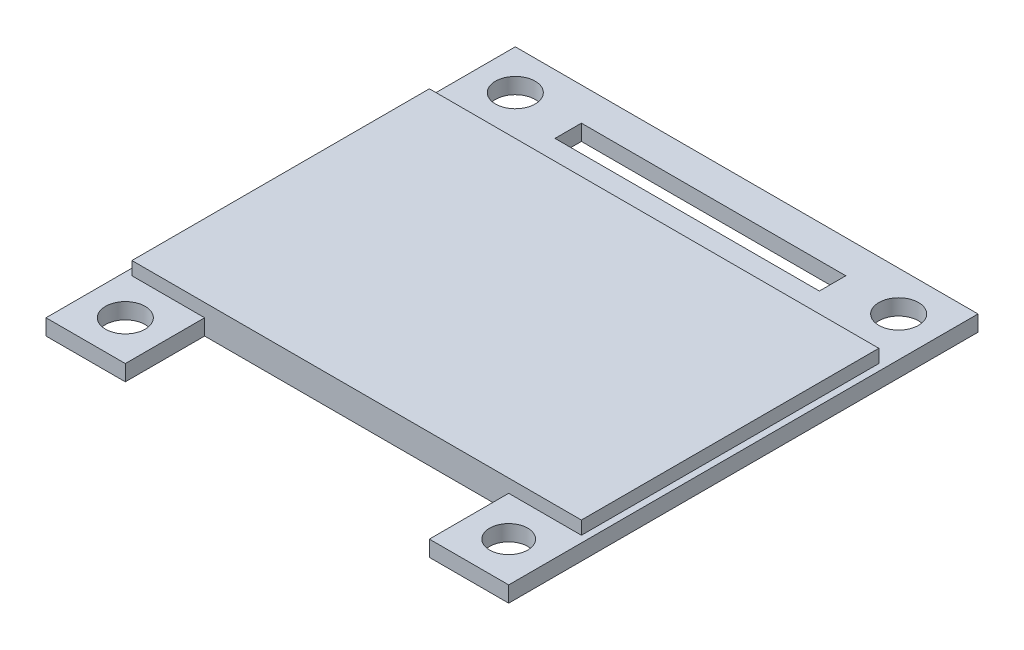
ISO-10303-21;
HEADER;
FILE_DESCRIPTION(('STEP AP214'),'2;1');
FILE_NAME('part.step','',(''),(''),'','','');
FILE_SCHEMA(('AUTOMOTIVE_DESIGN { 1 0 10303 214 1 1 1 1 }'));
ENDSEC;
DATA;
#1=APPLICATION_CONTEXT('core data for automotive mechanical design processes');
#2=APPLICATION_PROTOCOL_DEFINITION('international standard','automotive_design',2000,#1);
#3=PRODUCT_CONTEXT('',#1,'mechanical');
#4=PRODUCT('Part','Part','',(#3));
#5=PRODUCT_RELATED_PRODUCT_CATEGORY('part','',(#4));
#6=PRODUCT_DEFINITION_FORMATION('','',#4);
#7=PRODUCT_DEFINITION_CONTEXT('part definition',#1,'design');
#8=PRODUCT_DEFINITION('design','',#6,#7);
#9=PRODUCT_DEFINITION_SHAPE('','',#8);
#10=(LENGTH_UNIT() NAMED_UNIT(*) SI_UNIT(.MILLI.,.METRE.));
#11=(NAMED_UNIT(*) PLANE_ANGLE_UNIT() SI_UNIT($,.RADIAN.));
#12=(NAMED_UNIT(*) SI_UNIT($,.STERADIAN.) SOLID_ANGLE_UNIT());
#13=UNCERTAINTY_MEASURE_WITH_UNIT(LENGTH_MEASURE(1.E-05),#10,'distance_accuracy_value','');
#14=(GEOMETRIC_REPRESENTATION_CONTEXT(3) GLOBAL_UNCERTAINTY_ASSIGNED_CONTEXT((#13)) GLOBAL_UNIT_ASSIGNED_CONTEXT((#10,
#11,#12)) REPRESENTATION_CONTEXT('',''));
#15=CARTESIAN_POINT('',(0.,0.,0.));
#16=DIRECTION('',(0.,0.,1.));
#17=DIRECTION('',(1.,0.,0.));
#18=AXIS2_PLACEMENT_3D('',#15,#16,#17);
#19=CARTESIAN_POINT('',(0.,1.2,-27.));
#20=DIRECTION('',(0.,0.,-1.));
#21=DIRECTION('',(-1.,0.,0.));
#22=AXIS2_PLACEMENT_3D('',#19,#20,#21);
#23=PLANE('',#22);
#24=DIRECTION('',(1.,0.,0.));
#25=VECTOR('',#24,1.);
#26=CARTESIAN_POINT('',(0.,0.,-27.));
#27=LINE('',#26,#25);
#28=CARTESIAN_POINT('',(7.49999999999999,0.,-27.));
#29=VERTEX_POINT('',#28);
#30=CARTESIAN_POINT('',(27.5,0.,-27.));
#31=VERTEX_POINT('',#30);
#32=EDGE_CURVE('E206',#29,#31,#27,.T.);
#33=ORIENTED_EDGE('',*,*,#32,.T.);
#34=DIRECTION('',(0.,-1.,0.));
#35=VECTOR('',#34,1.);
#36=CARTESIAN_POINT('',(27.5,1.2,-27.));
#37=LINE('',#36,#35);
#38=CARTESIAN_POINT('',(27.5,1.2,-27.));
#39=VERTEX_POINT('',#38);
#40=EDGE_CURVE('E11',#39,#31,#37,.T.);
#41=ORIENTED_EDGE('',*,*,#40,.F.);
#42=DIRECTION('',(1.,0.,0.));
#43=VECTOR('',#42,1.);
#44=CARTESIAN_POINT('',(0.,1.2,-27.));
#45=LINE('',#44,#43);
#46=CARTESIAN_POINT('',(7.49999999999999,1.2,-27.));
#47=VERTEX_POINT('',#46);
#48=EDGE_CURVE('E140',#47,#39,#45,.T.);
#49=ORIENTED_EDGE('',*,*,#48,.F.);
#50=DIRECTION('',(0.,-1.,0.));
#51=VECTOR('',#50,1.);
#52=CARTESIAN_POINT('',(7.49999999999999,1.2,-27.));
#53=LINE('',#52,#51);
#54=EDGE_CURVE('E59',#47,#29,#53,.T.);
#55=ORIENTED_EDGE('',*,*,#54,.T.);
#56=EDGE_LOOP('',(#33,#41,#49,#55));
#57=FACE_BOUND('',#56,.T.);
#58=ADVANCED_FACE('F39',(#57),#23,.F.);
#59=CARTESIAN_POINT('',(27.5,1.2,0.));
#60=DIRECTION('',(1.,0.,0.));
#61=DIRECTION('',(0.,0.,-1.));
#62=AXIS2_PLACEMENT_3D('',#59,#60,#61);
#63=PLANE('',#62);
#64=DIRECTION('',(0.,0.,1.));
#65=VECTOR('',#64,1.);
#66=CARTESIAN_POINT('',(27.5,0.,0.));
#67=LINE('',#66,#65);
#68=CARTESIAN_POINT('',(27.5,0.,-25.));
#69=VERTEX_POINT('',#68);
#70=EDGE_CURVE('E147',#31,#69,#67,.T.);
#71=ORIENTED_EDGE('',*,*,#70,.T.);
#72=DIRECTION('',(0.,-1.,0.));
#73=VECTOR('',#72,1.);
#74=CARTESIAN_POINT('',(27.5,1.2,-25.));
#75=LINE('',#74,#73);
#76=CARTESIAN_POINT('',(27.5,1.2,-25.));
#77=VERTEX_POINT('',#76);
#78=EDGE_CURVE('E50',#77,#69,#75,.T.);
#79=ORIENTED_EDGE('',*,*,#78,.F.);
#80=DIRECTION('',(0.,0.,1.));
#81=VECTOR('',#80,1.);
#82=CARTESIAN_POINT('',(27.5,1.2,0.));
#83=LINE('',#82,#81);
#84=EDGE_CURVE('E133',#39,#77,#83,.T.);
#85=ORIENTED_EDGE('',*,*,#84,.F.);
#86=ORIENTED_EDGE('',*,*,#40,.T.);
#87=EDGE_LOOP('',(#71,#79,#85,#86));
#88=FACE_BOUND('',#87,.T.);
#89=ADVANCED_FACE('F146',(#88),#63,.F.);
#90=CARTESIAN_POINT('',(0.,1.2,-25.));
#91=DIRECTION('',(0.,0.,-1.));
#92=DIRECTION('',(-1.,0.,0.));
#93=AXIS2_PLACEMENT_3D('',#90,#91,#92);
#94=PLANE('',#93);
#95=DIRECTION('',(1.,0.,0.));
#96=VECTOR('',#95,1.);
#97=CARTESIAN_POINT('',(0.,0.,-25.));
#98=LINE('',#97,#96);
#99=CARTESIAN_POINT('',(7.49999999999999,0.,-25.));
#100=VERTEX_POINT('',#99);
#101=EDGE_CURVE('E211',#100,#69,#98,.T.);
#102=ORIENTED_EDGE('',*,*,#101,.F.);
#103=DIRECTION('',(0.,-1.,0.));
#104=VECTOR('',#103,1.);
#105=CARTESIAN_POINT('',(7.49999999999999,1.2,-25.));
#106=LINE('',#105,#104);
#107=CARTESIAN_POINT('',(7.49999999999999,1.2,-25.));
#108=VERTEX_POINT('',#107);
#109=EDGE_CURVE('E95',#108,#100,#106,.T.);
#110=ORIENTED_EDGE('',*,*,#109,.F.);
#111=DIRECTION('',(1.,0.,0.));
#112=VECTOR('',#111,1.);
#113=CARTESIAN_POINT('',(0.,1.2,-25.));
#114=LINE('',#113,#112);
#115=EDGE_CURVE('E139',#108,#77,#114,.T.);
#116=ORIENTED_EDGE('',*,*,#115,.T.);
#117=ORIENTED_EDGE('',*,*,#78,.T.);
#118=EDGE_LOOP('',(#102,#110,#116,#117));
#119=FACE_BOUND('',#118,.T.);
#120=ADVANCED_FACE('F152',(#119),#94,.T.);
#121=CARTESIAN_POINT('',(29.,1.2,0.));
#122=DIRECTION('',(1.,0.,0.));
#123=DIRECTION('',(0.,0.,-1.));
#124=AXIS2_PLACEMENT_3D('',#121,#122,#123);
#125=PLANE('',#124);
#126=DIRECTION('',(0.,0.,1.));
#127=VECTOR('',#126,1.);
#128=CARTESIAN_POINT('',(29.,0.,0.));
#129=LINE('',#128,#127);
#130=CARTESIAN_POINT('',(29.,0.,0.));
#131=VERTEX_POINT('',#130);
#132=CARTESIAN_POINT('',(29.,0.,6.));
#133=VERTEX_POINT('',#132);
#134=EDGE_CURVE('E169',#131,#133,#129,.T.);
#135=ORIENTED_EDGE('',*,*,#134,.T.);
#136=DIRECTION('',(0.,-1.,0.));
#137=VECTOR('',#136,1.);
#138=CARTESIAN_POINT('',(29.,1.2,6.));
#139=LINE('',#138,#137);
#140=CARTESIAN_POINT('',(29.,1.2,6.));
#141=VERTEX_POINT('',#140);
#142=EDGE_CURVE('E244',#141,#133,#139,.T.);
#143=ORIENTED_EDGE('',*,*,#142,.F.);
#144=DIRECTION('',(0.,0.,1.));
#145=VECTOR('',#144,1.);
#146=CARTESIAN_POINT('',(29.,1.2,0.));
#147=LINE('',#146,#145);
#148=CARTESIAN_POINT('',(29.,1.2,0.));
#149=VERTEX_POINT('',#148);
#150=EDGE_CURVE('E108',#149,#141,#147,.T.);
#151=ORIENTED_EDGE('',*,*,#150,.F.);
#152=DIRECTION('',(0.,-1.,0.));
#153=VECTOR('',#152,1.);
#154=CARTESIAN_POINT('',(29.,1.2,0.));
#155=LINE('',#154,#153);
#156=EDGE_CURVE('E43',#149,#131,#155,.T.);
#157=ORIENTED_EDGE('',*,*,#156,.T.);
#158=EDGE_LOOP('',(#135,#143,#151,#157));
#159=FACE_BOUND('',#158,.T.);
#160=ADVANCED_FACE('F255',(#159),#125,.F.);
#161=CARTESIAN_POINT('',(0.,1.2,6.00000000000001));
#162=DIRECTION('',(0.,0.,1.));
#163=DIRECTION('',(1.,0.,0.));
#164=AXIS2_PLACEMENT_3D('',#161,#162,#163);
#165=PLANE('',#164);
#166=DIRECTION('',(-1.,0.,0.));
#167=VECTOR('',#166,1.);
#168=CARTESIAN_POINT('',(0.,0.,6.00000000000001));
#169=LINE('',#168,#167);
#170=CARTESIAN_POINT('',(35.,0.,6.));
#171=VERTEX_POINT('',#170);
#172=EDGE_CURVE('E174',#171,#133,#169,.T.);
#173=ORIENTED_EDGE('',*,*,#172,.F.);
#174=DIRECTION('',(0.,-1.,0.));
#175=VECTOR('',#174,1.);
#176=CARTESIAN_POINT('',(35.,1.2,6.));
#177=LINE('',#176,#175);
#178=CARTESIAN_POINT('',(35.,1.2,6.));
#179=VERTEX_POINT('',#178);
#180=EDGE_CURVE('E242',#179,#171,#177,.T.);
#181=ORIENTED_EDGE('',*,*,#180,.F.);
#182=DIRECTION('',(-1.,0.,0.));
#183=VECTOR('',#182,1.);
#184=CARTESIAN_POINT('',(0.,1.2,6.00000000000001));
#185=LINE('',#184,#183);
#186=EDGE_CURVE('E269',#179,#141,#185,.T.);
#187=ORIENTED_EDGE('',*,*,#186,.T.);
#188=ORIENTED_EDGE('',*,*,#142,.T.);
#189=EDGE_LOOP('',(#173,#181,#187,#188));
#190=FACE_BOUND('',#189,.T.);
#191=ADVANCED_FACE('F268',(#190),#165,.T.);
#192=CARTESIAN_POINT('',(35.,1.2,0.));
#193=DIRECTION('',(1.,0.,0.));
#194=DIRECTION('',(0.,0.,-1.));
#195=AXIS2_PLACEMENT_3D('',#192,#193,#194);
#196=PLANE('',#195);
#197=DIRECTION('',(0.,0.,1.));
#198=VECTOR('',#197,1.);
#199=CARTESIAN_POINT('',(35.,0.,0.));
#200=LINE('',#199,#198);
#201=CARTESIAN_POINT('',(35.,0.,-29.5));
#202=VERTEX_POINT('',#201);
#203=EDGE_CURVE('E178',#202,#171,#200,.T.);
#204=ORIENTED_EDGE('',*,*,#203,.F.);
#205=DIRECTION('',(0.,-1.,0.));
#206=VECTOR('',#205,1.);
#207=CARTESIAN_POINT('',(35.,1.2,-29.5));
#208=LINE('',#207,#206);
#209=CARTESIAN_POINT('',(35.,1.2,-29.5));
#210=VERTEX_POINT('',#209);
#211=EDGE_CURVE('E239',#210,#202,#208,.T.);
#212=ORIENTED_EDGE('',*,*,#211,.F.);
#213=DIRECTION('',(0.,0.,1.));
#214=VECTOR('',#213,1.);
#215=CARTESIAN_POINT('',(35.,1.2,0.));
#216=LINE('',#215,#214);
#217=EDGE_CURVE('E275',#210,#179,#216,.T.);
#218=ORIENTED_EDGE('',*,*,#217,.T.);
#219=ORIENTED_EDGE('',*,*,#180,.T.);
#220=EDGE_LOOP('',(#204,#212,#218,#219));
#221=FACE_BOUND('',#220,.T.);
#222=ADVANCED_FACE('F279',(#221),#196,.T.);
#223=CARTESIAN_POINT('',(0.,1.2,-29.5));
#224=DIRECTION('',(0.,0.,-1.));
#225=DIRECTION('',(-1.,0.,0.));
#226=AXIS2_PLACEMENT_3D('',#223,#224,#225);
#227=PLANE('',#226);
#228=DIRECTION('',(1.,0.,0.));
#229=VECTOR('',#228,1.);
#230=CARTESIAN_POINT('',(0.,0.,-29.5));
#231=LINE('',#230,#229);
#232=CARTESIAN_POINT('',(0.,0.,-29.5));
#233=VERTEX_POINT('',#232);
#234=EDGE_CURVE('E182',#233,#202,#231,.T.);
#235=ORIENTED_EDGE('',*,*,#234,.F.);
#236=DIRECTION('',(0.,-1.,0.));
#237=VECTOR('',#236,1.);
#238=CARTESIAN_POINT('',(0.,1.2,-29.5));
#239=LINE('',#238,#237);
#240=CARTESIAN_POINT('',(0.,1.2,-29.5));
#241=VERTEX_POINT('',#240);
#242=EDGE_CURVE('E236',#241,#233,#239,.T.);
#243=ORIENTED_EDGE('',*,*,#242,.F.);
#244=DIRECTION('',(1.,0.,0.));
#245=VECTOR('',#244,1.);
#246=CARTESIAN_POINT('',(0.,1.2,-29.5));
#247=LINE('',#246,#245);
#248=EDGE_CURVE('E281',#241,#210,#247,.T.);
#249=ORIENTED_EDGE('',*,*,#248,.T.);
#250=ORIENTED_EDGE('',*,*,#211,.T.);
#251=EDGE_LOOP('',(#235,#243,#249,#250));
#252=FACE_BOUND('',#251,.T.);
#253=ADVANCED_FACE('F368',(#252),#227,.T.);
#254=CARTESIAN_POINT('',(0.,1.2,0.));
#255=DIRECTION('',(-1.,0.,0.));
#256=DIRECTION('',(0.,0.,1.));
#257=AXIS2_PLACEMENT_3D('',#254,#255,#256);
#258=PLANE('',#257);
#259=DIRECTION('',(0.,0.,-1.));
#260=VECTOR('',#259,1.);
#261=CARTESIAN_POINT('',(0.,0.,0.));
#262=LINE('',#261,#260);
#263=CARTESIAN_POINT('',(0.,0.,6.));
#264=VERTEX_POINT('',#263);
#265=EDGE_CURVE('E186',#264,#233,#262,.T.);
#266=ORIENTED_EDGE('',*,*,#265,.F.);
#267=DIRECTION('',(0.,-1.,0.));
#268=VECTOR('',#267,1.);
#269=CARTESIAN_POINT('',(0.,1.2,6.));
#270=LINE('',#269,#268);
#271=CARTESIAN_POINT('',(0.,1.2,6.));
#272=VERTEX_POINT('',#271);
#273=EDGE_CURVE('E233',#272,#264,#270,.T.);
#274=ORIENTED_EDGE('',*,*,#273,.F.);
#275=DIRECTION('',(0.,0.,-1.));
#276=VECTOR('',#275,1.);
#277=CARTESIAN_POINT('',(0.,1.2,0.));
#278=LINE('',#277,#276);
#279=EDGE_CURVE('E284',#272,#241,#278,.T.);
#280=ORIENTED_EDGE('',*,*,#279,.T.);
#281=ORIENTED_EDGE('',*,*,#242,.T.);
#282=EDGE_LOOP('',(#266,#274,#280,#281));
#283=FACE_BOUND('',#282,.T.);
#284=ADVANCED_FACE('F364',(#283),#258,.T.);
#285=CARTESIAN_POINT('',(0.,1.2,6.));
#286=DIRECTION('',(0.,0.,-1.));
#287=DIRECTION('',(-1.,0.,0.));
#288=AXIS2_PLACEMENT_3D('',#285,#286,#287);
#289=PLANE('',#288);
#290=DIRECTION('',(1.,0.,0.));
#291=VECTOR('',#290,1.);
#292=CARTESIAN_POINT('',(0.,0.,6.));
#293=LINE('',#292,#291);
#294=CARTESIAN_POINT('',(6.,0.,6.));
#295=VERTEX_POINT('',#294);
#296=EDGE_CURVE('E190',#264,#295,#293,.T.);
#297=ORIENTED_EDGE('',*,*,#296,.T.);
#298=DIRECTION('',(0.,-1.,0.));
#299=VECTOR('',#298,1.);
#300=CARTESIAN_POINT('',(6.,1.2,6.));
#301=LINE('',#300,#299);
#302=CARTESIAN_POINT('',(6.,1.2,6.));
#303=VERTEX_POINT('',#302);
#304=EDGE_CURVE('E230',#303,#295,#301,.T.);
#305=ORIENTED_EDGE('',*,*,#304,.F.);
#306=DIRECTION('',(1.,0.,0.));
#307=VECTOR('',#306,1.);
#308=CARTESIAN_POINT('',(0.,1.2,6.));
#309=LINE('',#308,#307);
#310=EDGE_CURVE('E291',#272,#303,#309,.T.);
#311=ORIENTED_EDGE('',*,*,#310,.F.);
#312=ORIENTED_EDGE('',*,*,#273,.T.);
#313=EDGE_LOOP('',(#297,#305,#311,#312));
#314=FACE_BOUND('',#313,.T.);
#315=ADVANCED_FACE('F360',(#314),#289,.F.);
#316=CARTESIAN_POINT('',(6.,1.2,0.));
#317=DIRECTION('',(1.,0.,0.));
#318=DIRECTION('',(0.,0.,-1.));
#319=AXIS2_PLACEMENT_3D('',#316,#317,#318);
#320=PLANE('',#319);
#321=DIRECTION('',(0.,0.,1.));
#322=VECTOR('',#321,1.);
#323=CARTESIAN_POINT('',(6.,0.,0.));
#324=LINE('',#323,#322);
#325=CARTESIAN_POINT('',(6.,0.,0.));
#326=VERTEX_POINT('',#325);
#327=EDGE_CURVE('E194',#326,#295,#324,.T.);
#328=ORIENTED_EDGE('',*,*,#327,.F.);
#329=DIRECTION('',(0.,-1.,0.));
#330=VECTOR('',#329,1.);
#331=CARTESIAN_POINT('',(6.,1.2,0.));
#332=LINE('',#331,#330);
#333=CARTESIAN_POINT('',(6.,1.2,0.));
#334=VERTEX_POINT('',#333);
#335=EDGE_CURVE('E164',#334,#326,#332,.T.);
#336=ORIENTED_EDGE('',*,*,#335,.F.);
#337=DIRECTION('',(0.,0.,1.));
#338=VECTOR('',#337,1.);
#339=CARTESIAN_POINT('',(6.,1.2,0.));
#340=LINE('',#339,#338);
#341=EDGE_CURVE('E294',#334,#303,#340,.T.);
#342=ORIENTED_EDGE('',*,*,#341,.T.);
#343=ORIENTED_EDGE('',*,*,#304,.T.);
#344=EDGE_LOOP('',(#328,#336,#342,#343));
#345=FACE_BOUND('',#344,.T.);
#346=ADVANCED_FACE('F357',(#345),#320,.T.);
#347=CARTESIAN_POINT('',(7.50000000000001,1.2,0.));
#348=DIRECTION('',(1.,0.,0.));
#349=DIRECTION('',(0.,0.,-1.));
#350=AXIS2_PLACEMENT_3D('',#347,#348,#349);
#351=PLANE('',#350);
#352=DIRECTION('',(0.,0.,1.));
#353=VECTOR('',#352,1.);
#354=CARTESIAN_POINT('',(7.50000000000001,0.,0.));
#355=LINE('',#354,#353);
#356=EDGE_CURVE('E214',#29,#100,#355,.T.);
#357=ORIENTED_EDGE('',*,*,#356,.F.);
#358=ORIENTED_EDGE('',*,*,#54,.F.);
#359=DIRECTION('',(0.,0.,1.));
#360=VECTOR('',#359,1.);
#361=CARTESIAN_POINT('',(7.50000000000001,1.2,0.));
#362=LINE('',#361,#360);
#363=EDGE_CURVE('E154',#47,#108,#362,.T.);
#364=ORIENTED_EDGE('',*,*,#363,.T.);
#365=ORIENTED_EDGE('',*,*,#109,.T.);
#366=EDGE_LOOP('',(#357,#358,#364,#365));
#367=FACE_BOUND('',#366,.T.);
#368=ADVANCED_FACE('F353',(#367),#351,.T.);
#369=CARTESIAN_POINT('',(3.,1.2,-26.5));
#370=DIRECTION('',(0.,-1.,0.));
#371=DIRECTION('',(0.,0.,-1.));
#372=AXIS2_PLACEMENT_3D('',#369,#370,#371);
#373=CYLINDRICAL_SURFACE('',#372,1.5);
#374=CARTESIAN_POINT('',(3.,1.2,-26.5));
#375=DIRECTION('',(0.,1.,0.));
#376=DIRECTION('',(0.,0.,1.));
#377=AXIS2_PLACEMENT_3D('',#374,#375,#376);
#378=CIRCLE('',#377,1.5);
#379=CARTESIAN_POINT('',(3.,1.2,-25.));
#380=VERTEX_POINT('',#379);
#381=EDGE_CURVE('E318',#380,#380,#378,.T.);
#382=ORIENTED_EDGE('',*,*,#381,.T.);
#383=EDGE_LOOP('',(#382));
#384=FACE_BOUND('',#383,.T.);
#385=CARTESIAN_POINT('',(3.,0.,-26.5));
#386=DIRECTION('',(0.,1.,0.));
#387=DIRECTION('',(0.,0.,1.));
#388=AXIS2_PLACEMENT_3D('',#385,#386,#387);
#389=CIRCLE('',#388,1.5);
#390=CARTESIAN_POINT('',(3.,0.,-25.));
#391=VERTEX_POINT('',#390);
#392=EDGE_CURVE('E202',#391,#391,#389,.T.);
#393=ORIENTED_EDGE('',*,*,#392,.F.);
#394=EDGE_LOOP('',(#393));
#395=FACE_BOUND('',#394,.T.);
#396=ADVANCED_FACE('F324',(#384,#395),#373,.F.);
#397=CARTESIAN_POINT('',(32.,1.2,-26.5));
#398=DIRECTION('',(0.,-1.,0.));
#399=DIRECTION('',(0.,0.,-1.));
#400=AXIS2_PLACEMENT_3D('',#397,#398,#399);
#401=CYLINDRICAL_SURFACE('',#400,1.5);
#402=CARTESIAN_POINT('',(32.,1.2,-26.5));
#403=DIRECTION('',(0.,1.,0.));
#404=DIRECTION('',(0.,0.,1.));
#405=AXIS2_PLACEMENT_3D('',#402,#403,#404);
#406=CIRCLE('',#405,1.5);
#407=CARTESIAN_POINT('',(32.,1.2,-25.));
#408=VERTEX_POINT('',#407);
#409=EDGE_CURVE('E314',#408,#408,#406,.T.);
#410=ORIENTED_EDGE('',*,*,#409,.T.);
#411=EDGE_LOOP('',(#410));
#412=FACE_BOUND('',#411,.T.);
#413=CARTESIAN_POINT('',(32.,0.,-26.5));
#414=DIRECTION('',(0.,1.,0.));
#415=DIRECTION('',(0.,0.,1.));
#416=AXIS2_PLACEMENT_3D('',#413,#414,#415);
#417=CIRCLE('',#416,1.5);
#418=CARTESIAN_POINT('',(32.,0.,-25.));
#419=VERTEX_POINT('',#418);
#420=EDGE_CURVE('E198',#419,#419,#417,.T.);
#421=ORIENTED_EDGE('',*,*,#420,.F.);
#422=EDGE_LOOP('',(#421));
#423=FACE_BOUND('',#422,.T.);
#424=ADVANCED_FACE('F352',(#412,#423),#401,.F.);
#425=CARTESIAN_POINT('',(32.,1.2,3.));
#426=DIRECTION('',(0.,-1.,0.));
#427=DIRECTION('',(0.,0.,-1.));
#428=AXIS2_PLACEMENT_3D('',#425,#426,#427);
#429=CYLINDRICAL_SURFACE('',#428,1.43967062224583);
#430=CARTESIAN_POINT('',(32.,1.2,3.));
#431=DIRECTION('',(0.,1.,0.));
#432=DIRECTION('',(0.,0.,1.));
#433=AXIS2_PLACEMENT_3D('',#430,#431,#432);
#434=CIRCLE('',#433,1.43967062224583);
#435=CARTESIAN_POINT('',(32.,1.2,4.43967062224583));
#436=VERTEX_POINT('',#435);
#437=EDGE_CURVE('E222',#436,#436,#434,.T.);
#438=ORIENTED_EDGE('',*,*,#437,.T.);
#439=EDGE_LOOP('',(#438));
#440=FACE_BOUND('',#439,.T.);
#441=CARTESIAN_POINT('',(32.,0.,3.));
#442=DIRECTION('',(0.,1.,0.));
#443=DIRECTION('',(0.,0.,1.));
#444=AXIS2_PLACEMENT_3D('',#441,#442,#443);
#445=CIRCLE('',#444,1.43967062224583);
#446=CARTESIAN_POINT('',(32.,0.,4.43967062224583));
#447=VERTEX_POINT('',#446);
#448=EDGE_CURVE('E165',#447,#447,#445,.T.);
#449=ORIENTED_EDGE('',*,*,#448,.F.);
#450=EDGE_LOOP('',(#449));
#451=FACE_BOUND('',#450,.T.);
#452=ADVANCED_FACE('F41',(#440,#451),#429,.F.);
#453=CARTESIAN_POINT('',(3.,1.2,3.));
#454=DIRECTION('',(0.,-1.,0.));
#455=DIRECTION('',(0.,0.,-1.));
#456=AXIS2_PLACEMENT_3D('',#453,#454,#455);
#457=CYLINDRICAL_SURFACE('',#456,1.5);
#458=CARTESIAN_POINT('',(3.,1.2,3.));
#459=DIRECTION('',(0.,1.,0.));
#460=DIRECTION('',(0.,0.,1.));
#461=AXIS2_PLACEMENT_3D('',#458,#459,#460);
#462=CIRCLE('',#461,1.5);
#463=CARTESIAN_POINT('',(3.,1.2,4.5));
#464=VERTEX_POINT('',#463);
#465=EDGE_CURVE('E157',#464,#464,#462,.T.);
#466=ORIENTED_EDGE('',*,*,#465,.T.);
#467=EDGE_LOOP('',(#466));
#468=FACE_BOUND('',#467,.T.);
#469=CARTESIAN_POINT('',(3.,0.,3.));
#470=DIRECTION('',(0.,1.,0.));
#471=DIRECTION('',(0.,0.,1.));
#472=AXIS2_PLACEMENT_3D('',#469,#470,#471);
#473=CIRCLE('',#472,1.5);
#474=CARTESIAN_POINT('',(3.,0.,4.5));
#475=VERTEX_POINT('',#474);
#476=EDGE_CURVE('E218',#475,#475,#473,.T.);
#477=ORIENTED_EDGE('',*,*,#476,.F.);
#478=EDGE_LOOP('',(#477));
#479=FACE_BOUND('',#478,.T.);
#480=ADVANCED_FACE('F328',(#468,#479),#457,.F.);
#481=CARTESIAN_POINT('',(0.,1.2,0.));
#482=DIRECTION('',(0.,1.,0.));
#483=DIRECTION('',(0.,0.,1.));
#484=AXIS2_PLACEMENT_3D('',#481,#482,#483);
#485=PLANE('',#484);
#486=ORIENTED_EDGE('',*,*,#437,.F.);
#487=EDGE_LOOP('',(#486));
#488=FACE_BOUND('',#487,.T.);
#489=DIRECTION('',(1.,0.,0.));
#490=VECTOR('',#489,1.);
#491=CARTESIAN_POINT('',(0.,1.2,0.));
#492=LINE('',#491,#490);
#493=CARTESIAN_POINT('',(34.5,1.2,0.));
#494=VERTEX_POINT('',#493);
#495=EDGE_CURVE('E537',#149,#494,#492,.T.);
#496=ORIENTED_EDGE('',*,*,#495,.F.);
#497=ORIENTED_EDGE('',*,*,#150,.T.);
#498=ORIENTED_EDGE('',*,*,#186,.F.);
#499=ORIENTED_EDGE('',*,*,#217,.F.);
#500=ORIENTED_EDGE('',*,*,#248,.F.);
#501=ORIENTED_EDGE('',*,*,#279,.F.);
#502=ORIENTED_EDGE('',*,*,#310,.T.);
#503=ORIENTED_EDGE('',*,*,#341,.F.);
#504=DIRECTION('',(1.,0.,0.));
#505=VECTOR('',#504,1.);
#506=CARTESIAN_POINT('',(0.,1.2,0.));
#507=LINE('',#506,#505);
#508=CARTESIAN_POINT('',(0.500000000000002,1.2,0.));
#509=VERTEX_POINT('',#508);
#510=EDGE_CURVE('E298',#509,#334,#507,.T.);
#511=ORIENTED_EDGE('',*,*,#510,.F.);
#512=DIRECTION('',(0.,0.,1.));
#513=VECTOR('',#512,1.);
#514=CARTESIAN_POINT('',(0.500000000000003,1.2,0.));
#515=LINE('',#514,#513);
#516=CARTESIAN_POINT('',(0.500000000000001,1.2,-22.5));
#517=VERTEX_POINT('',#516);
#518=EDGE_CURVE('E302',#517,#509,#515,.T.);
#519=ORIENTED_EDGE('',*,*,#518,.F.);
#520=DIRECTION('',(1.,0.,0.));
#521=VECTOR('',#520,1.);
#522=CARTESIAN_POINT('',(0.,1.2,-22.5));
#523=LINE('',#522,#521);
#524=CARTESIAN_POINT('',(34.5,1.2,-22.5));
#525=VERTEX_POINT('',#524);
#526=EDGE_CURVE('E306',#517,#525,#523,.T.);
#527=ORIENTED_EDGE('',*,*,#526,.T.);
#528=DIRECTION('',(0.,0.,1.));
#529=VECTOR('',#528,1.);
#530=CARTESIAN_POINT('',(34.5,1.2,0.));
#531=LINE('',#530,#529);
#532=EDGE_CURVE('E310',#525,#494,#531,.T.);
#533=ORIENTED_EDGE('',*,*,#532,.T.);
#534=EDGE_LOOP('',(#496,#497,#498,#499,#500,#501,#502,#503,#511,#519,#527,#533));
#535=FACE_BOUND('',#534,.T.);
#536=ORIENTED_EDGE('',*,*,#409,.F.);
#537=EDGE_LOOP('',(#536));
#538=FACE_BOUND('',#537,.T.);
#539=ORIENTED_EDGE('',*,*,#381,.F.);
#540=EDGE_LOOP('',(#539));
#541=FACE_BOUND('',#540,.T.);
#542=ORIENTED_EDGE('',*,*,#48,.T.);
#543=ORIENTED_EDGE('',*,*,#84,.T.);
#544=ORIENTED_EDGE('',*,*,#115,.F.);
#545=ORIENTED_EDGE('',*,*,#363,.F.);
#546=EDGE_LOOP('',(#542,#543,#544,#545));
#547=FACE_BOUND('',#546,.T.);
#548=ORIENTED_EDGE('',*,*,#465,.F.);
#549=EDGE_LOOP('',(#548));
#550=FACE_BOUND('',#549,.T.);
#551=ADVANCED_FACE('F135',(#488,#535,#538,#541,#547,#550),#485,.T.);
#552=CARTESIAN_POINT('',(0.,0.,0.));
#553=DIRECTION('',(0.,1.,0.));
#554=DIRECTION('',(0.,0.,1.));
#555=AXIS2_PLACEMENT_3D('',#552,#553,#554);
#556=PLANE('',#555);
#557=ORIENTED_EDGE('',*,*,#448,.T.);
#558=EDGE_LOOP('',(#557));
#559=FACE_BOUND('',#558,.T.);
#560=ORIENTED_EDGE('',*,*,#134,.F.);
#561=DIRECTION('',(1.,0.,0.));
#562=VECTOR('',#561,1.);
#563=CARTESIAN_POINT('',(0.,0.,0.));
#564=LINE('',#563,#562);
#565=EDGE_CURVE('E266',#326,#131,#564,.T.);
#566=ORIENTED_EDGE('',*,*,#565,.F.);
#567=ORIENTED_EDGE('',*,*,#327,.T.);
#568=ORIENTED_EDGE('',*,*,#296,.F.);
#569=ORIENTED_EDGE('',*,*,#265,.T.);
#570=ORIENTED_EDGE('',*,*,#234,.T.);
#571=ORIENTED_EDGE('',*,*,#203,.T.);
#572=ORIENTED_EDGE('',*,*,#172,.T.);
#573=EDGE_LOOP('',(#560,#566,#567,#568,#569,#570,#571,#572));
#574=FACE_BOUND('',#573,.T.);
#575=ORIENTED_EDGE('',*,*,#420,.T.);
#576=EDGE_LOOP('',(#575));
#577=FACE_BOUND('',#576,.T.);
#578=ORIENTED_EDGE('',*,*,#392,.T.);
#579=EDGE_LOOP('',(#578));
#580=FACE_BOUND('',#579,.T.);
#581=ORIENTED_EDGE('',*,*,#32,.F.);
#582=ORIENTED_EDGE('',*,*,#356,.T.);
#583=ORIENTED_EDGE('',*,*,#101,.T.);
#584=ORIENTED_EDGE('',*,*,#70,.F.);
#585=EDGE_LOOP('',(#581,#582,#583,#584));
#586=FACE_BOUND('',#585,.T.);
#587=ORIENTED_EDGE('',*,*,#476,.T.);
#588=EDGE_LOOP('',(#587));
#589=FACE_BOUND('',#588,.T.);
#590=ADVANCED_FACE('F264',(#559,#574,#577,#580,#586,#589),#556,.F.);
#591=CARTESIAN_POINT('',(0.,2.2,0.));
#592=DIRECTION('',(0.,0.,-1.));
#593=DIRECTION('',(-1.,0.,0.));
#594=AXIS2_PLACEMENT_3D('',#591,#592,#593);
#595=PLANE('',#594);
#596=ORIENTED_EDGE('',*,*,#565,.T.);
#597=ORIENTED_EDGE('',*,*,#156,.F.);
#598=ORIENTED_EDGE('',*,*,#495,.T.);
#599=DIRECTION('',(0.,-1.,0.));
#600=VECTOR('',#599,1.);
#601=CARTESIAN_POINT('',(34.5,2.2,0.));
#602=LINE('',#601,#600);
#603=CARTESIAN_POINT('',(34.5,2.2,0.));
#604=VERTEX_POINT('',#603);
#605=EDGE_CURVE('E521',#604,#494,#602,.T.);
#606=ORIENTED_EDGE('',*,*,#605,.F.);
#607=DIRECTION('',(1.,0.,0.));
#608=VECTOR('',#607,1.);
#609=CARTESIAN_POINT('',(0.,2.2,0.));
#610=LINE('',#609,#608);
#611=CARTESIAN_POINT('',(0.500000000000002,2.2,0.));
#612=VERTEX_POINT('',#611);
#613=EDGE_CURVE('E500',#612,#604,#610,.T.);
#614=ORIENTED_EDGE('',*,*,#613,.F.);
#615=DIRECTION('',(0.,-1.,0.));
#616=VECTOR('',#615,1.);
#617=CARTESIAN_POINT('',(0.500000000000002,2.2,0.));
#618=LINE('',#617,#616);
#619=EDGE_CURVE('E526',#612,#509,#618,.T.);
#620=ORIENTED_EDGE('',*,*,#619,.T.);
#621=ORIENTED_EDGE('',*,*,#510,.T.);
#622=ORIENTED_EDGE('',*,*,#335,.T.);
#623=EDGE_LOOP('',(#596,#597,#598,#606,#614,#620,#621,#622));
#624=FACE_BOUND('',#623,.T.);
#625=ADVANCED_FACE('F335',(#624),#595,.F.);
#626=CARTESIAN_POINT('',(34.5,2.2,0.));
#627=DIRECTION('',(1.,0.,0.));
#628=DIRECTION('',(0.,0.,-1.));
#629=AXIS2_PLACEMENT_3D('',#626,#627,#628);
#630=PLANE('',#629);
#631=ORIENTED_EDGE('',*,*,#605,.T.);
#632=ORIENTED_EDGE('',*,*,#532,.F.);
#633=DIRECTION('',(0.,-1.,0.));
#634=VECTOR('',#633,1.);
#635=CARTESIAN_POINT('',(34.5,2.2,-22.5));
#636=LINE('',#635,#634);
#637=CARTESIAN_POINT('',(34.5,2.2,-22.5));
#638=VERTEX_POINT('',#637);
#639=EDGE_CURVE('E170',#638,#525,#636,.T.);
#640=ORIENTED_EDGE('',*,*,#639,.F.);
#641=DIRECTION('',(0.,0.,1.));
#642=VECTOR('',#641,1.);
#643=CARTESIAN_POINT('',(34.5,2.2,0.));
#644=LINE('',#643,#642);
#645=EDGE_CURVE('E494',#638,#604,#644,.T.);
#646=ORIENTED_EDGE('',*,*,#645,.T.);
#647=EDGE_LOOP('',(#631,#632,#640,#646));
#648=FACE_BOUND('',#647,.T.);
#649=ADVANCED_FACE('F446',(#648),#630,.T.);
#650=CARTESIAN_POINT('',(0.,2.2,-22.5));
#651=DIRECTION('',(0.,0.,-1.));
#652=DIRECTION('',(-1.,0.,0.));
#653=AXIS2_PLACEMENT_3D('',#650,#651,#652);
#654=PLANE('',#653);
#655=ORIENTED_EDGE('',*,*,#639,.T.);
#656=ORIENTED_EDGE('',*,*,#526,.F.);
#657=DIRECTION('',(0.,-1.,0.));
#658=VECTOR('',#657,1.);
#659=CARTESIAN_POINT('',(0.500000000000001,2.2,-22.5));
#660=LINE('',#659,#658);
#661=CARTESIAN_POINT('',(0.500000000000001,2.2,-22.5));
#662=VERTEX_POINT('',#661);
#663=EDGE_CURVE('E511',#662,#517,#660,.T.);
#664=ORIENTED_EDGE('',*,*,#663,.F.);
#665=DIRECTION('',(1.,0.,0.));
#666=VECTOR('',#665,1.);
#667=CARTESIAN_POINT('',(0.,2.2,-22.5));
#668=LINE('',#667,#666);
#669=EDGE_CURVE('E498',#662,#638,#668,.T.);
#670=ORIENTED_EDGE('',*,*,#669,.T.);
#671=EDGE_LOOP('',(#655,#656,#664,#670));
#672=FACE_BOUND('',#671,.T.);
#673=ADVANCED_FACE('F456',(#672),#654,.T.);
#674=CARTESIAN_POINT('',(0.500000000000003,2.2,0.));
#675=DIRECTION('',(1.,0.,0.));
#676=DIRECTION('',(0.,0.,-1.));
#677=AXIS2_PLACEMENT_3D('',#674,#675,#676);
#678=PLANE('',#677);
#679=ORIENTED_EDGE('',*,*,#518,.T.);
#680=ORIENTED_EDGE('',*,*,#619,.F.);
#681=DIRECTION('',(0.,0.,1.));
#682=VECTOR('',#681,1.);
#683=CARTESIAN_POINT('',(0.500000000000003,2.2,0.));
#684=LINE('',#683,#682);
#685=EDGE_CURVE('E514',#662,#612,#684,.T.);
#686=ORIENTED_EDGE('',*,*,#685,.F.);
#687=ORIENTED_EDGE('',*,*,#663,.T.);
#688=EDGE_LOOP('',(#679,#680,#686,#687));
#689=FACE_BOUND('',#688,.T.);
#690=ADVANCED_FACE('F465',(#689),#678,.F.);
#691=CARTESIAN_POINT('',(0.,2.2,0.));
#692=DIRECTION('',(0.,1.,0.));
#693=DIRECTION('',(0.,0.,1.));
#694=AXIS2_PLACEMENT_3D('',#691,#692,#693);
#695=PLANE('',#694);
#696=ORIENTED_EDGE('',*,*,#645,.F.);
#697=ORIENTED_EDGE('',*,*,#669,.F.);
#698=ORIENTED_EDGE('',*,*,#685,.T.);
#699=ORIENTED_EDGE('',*,*,#613,.T.);
#700=EDGE_LOOP('',(#696,#697,#698,#699));
#701=FACE_BOUND('',#700,.T.);
#702=ADVANCED_FACE('F475',(#701),#695,.T.);
#703=CLOSED_SHELL('',(#58,#89,#120,#160,#191,#222,#253,#284,#315,#346,#368,#396,#424,#452,#480,
#551,#590,#625,#649,#673,#690,#702));
#704=MANIFOLD_SOLID_BREP('B2',#703);
#705=ADVANCED_BREP_SHAPE_REPRESENTATION('',(#18,#704),#14);
#706=SHAPE_DEFINITION_REPRESENTATION(#9,#705);
ENDSEC;
END-ISO-10303-21;
